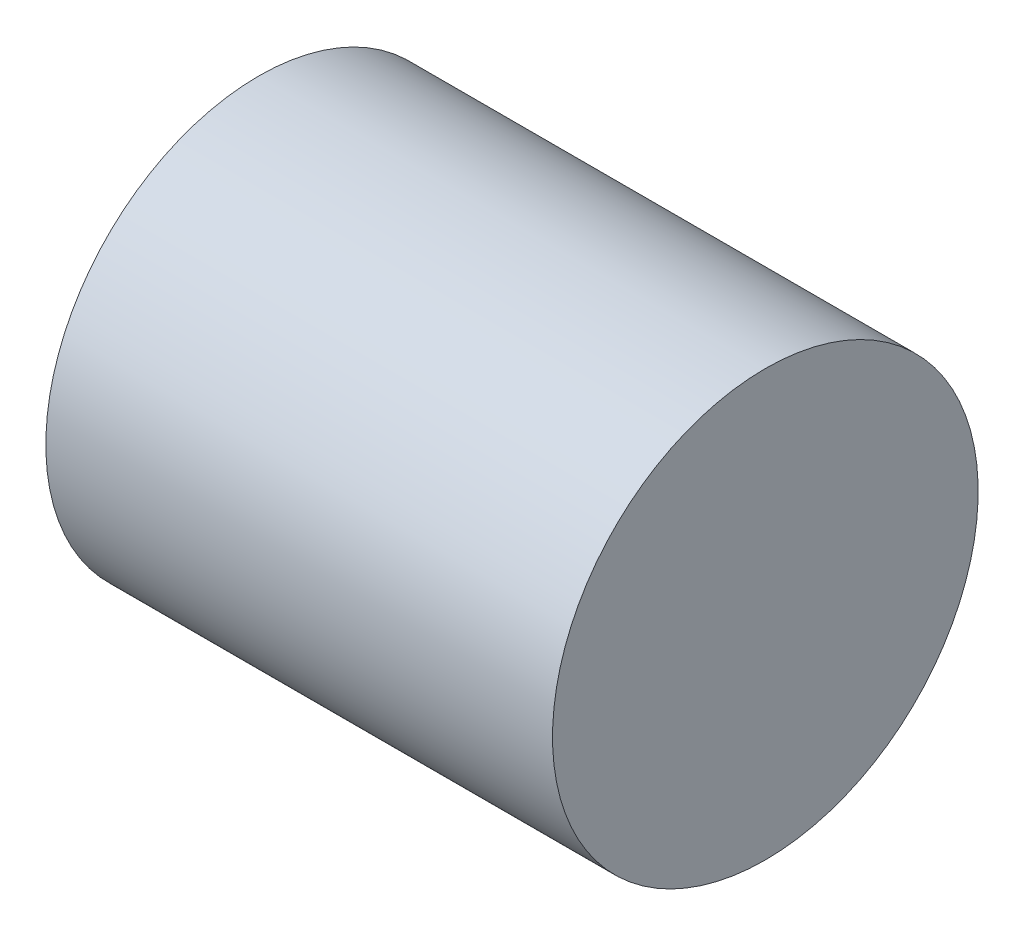
ISO-10303-21;
HEADER;
FILE_DESCRIPTION(('STEP AP214'),'2;1');
FILE_NAME('part.step','',(''),(''),'','','');
FILE_SCHEMA(('AUTOMOTIVE_DESIGN { 1 0 10303 214 1 1 1 1 }'));
ENDSEC;
DATA;
#1=APPLICATION_CONTEXT('core data for automotive mechanical design processes');
#2=APPLICATION_PROTOCOL_DEFINITION('international standard','automotive_design',2000,#1);
#3=PRODUCT_CONTEXT('',#1,'mechanical');
#4=PRODUCT('Part','Part','',(#3));
#5=PRODUCT_RELATED_PRODUCT_CATEGORY('part','',(#4));
#6=PRODUCT_DEFINITION_FORMATION('','',#4);
#7=PRODUCT_DEFINITION_CONTEXT('part definition',#1,'design');
#8=PRODUCT_DEFINITION('design','',#6,#7);
#9=PRODUCT_DEFINITION_SHAPE('','',#8);
#10=(LENGTH_UNIT() NAMED_UNIT(*) SI_UNIT(.MILLI.,.METRE.));
#11=(NAMED_UNIT(*) PLANE_ANGLE_UNIT() SI_UNIT($,.RADIAN.));
#12=(NAMED_UNIT(*) SI_UNIT($,.STERADIAN.) SOLID_ANGLE_UNIT());
#13=UNCERTAINTY_MEASURE_WITH_UNIT(LENGTH_MEASURE(1.E-05),#10,'distance_accuracy_value','');
#14=(GEOMETRIC_REPRESENTATION_CONTEXT(3) GLOBAL_UNCERTAINTY_ASSIGNED_CONTEXT((#13)) GLOBAL_UNIT_ASSIGNED_CONTEXT((#10,
#11,#12)) REPRESENTATION_CONTEXT('',''));
#15=CARTESIAN_POINT('',(0.,0.,0.));
#16=DIRECTION('',(0.,0.,1.));
#17=DIRECTION('',(1.,0.,0.));
#18=AXIS2_PLACEMENT_3D('',#15,#16,#17);
#19=CARTESIAN_POINT('',(112.014,-15.6103308824,-2.1696691176));
#20=DIRECTION('',(1.,0.,0.));
#21=DIRECTION('',(0.,0.,-1.));
#22=AXIS2_PLACEMENT_3D('',#19,#20,#21);
#23=PLANE('',#22);
#24=CARTESIAN_POINT('',(112.014,0.,-17.78));
#25=DIRECTION('',(1.,0.,0.));
#26=DIRECTION('',(0.,1.,0.));
#27=AXIS2_PLACEMENT_3D('',#24,#25,#26);
#28=CIRCLE('',#27,15.4252281538);
#29=CARTESIAN_POINT('',(112.014,15.4252281538,-17.78));
#30=VERTEX_POINT('',#29);
#31=EDGE_CURVE('E19',#30,#30,#28,.F.);
#32=ORIENTED_EDGE('',*,*,#31,.T.);
#33=EDGE_LOOP('',(#32));
#34=FACE_BOUND('',#33,.T.);
#35=ADVANCED_FACE('F15',(#34),#23,.F.);
#36=CARTESIAN_POINT('',(148.7375098142,-15.6103308824,-2.1696691176));
#37=DIRECTION('',(1.,0.,0.));
#38=DIRECTION('',(0.,0.,-1.));
#39=AXIS2_PLACEMENT_3D('',#36,#37,#38);
#40=PLANE('',#39);
#41=CARTESIAN_POINT('',(148.7375098142,0.,-17.78));
#42=DIRECTION('',(1.,0.,0.));
#43=DIRECTION('',(0.,1.,0.));
#44=AXIS2_PLACEMENT_3D('',#41,#42,#43);
#45=CIRCLE('',#44,15.4252281538);
#46=CARTESIAN_POINT('',(148.7375098142,15.4252281538,-17.78));
#47=VERTEX_POINT('',#46);
#48=EDGE_CURVE('E10',#47,#47,#45,.T.);
#49=ORIENTED_EDGE('',*,*,#48,.T.);
#50=EDGE_LOOP('',(#49));
#51=FACE_BOUND('',#50,.T.);
#52=ADVANCED_FACE('F17',(#51),#40,.T.);
#53=CARTESIAN_POINT('',(112.014,0.,-17.78));
#54=DIRECTION('',(1.,0.,0.));
#55=DIRECTION('',(0.,1.,0.));
#56=AXIS2_PLACEMENT_3D('',#53,#54,#55);
#57=CYLINDRICAL_SURFACE('',#56,15.4252281538);
#58=ORIENTED_EDGE('',*,*,#48,.F.);
#59=EDGE_LOOP('',(#58));
#60=FACE_BOUND('',#59,.T.);
#61=ORIENTED_EDGE('',*,*,#31,.F.);
#62=EDGE_LOOP('',(#61));
#63=FACE_BOUND('',#62,.T.);
#64=ADVANCED_FACE('F29',(#60,#63),#57,.T.);
#65=CLOSED_SHELL('',(#35,#52,#64));
#66=MANIFOLD_SOLID_BREP('B1',#65);
#67=ADVANCED_BREP_SHAPE_REPRESENTATION('',(#18,#66),#14);
#68=SHAPE_DEFINITION_REPRESENTATION(#9,#67);
ENDSEC;
END-ISO-10303-21;
